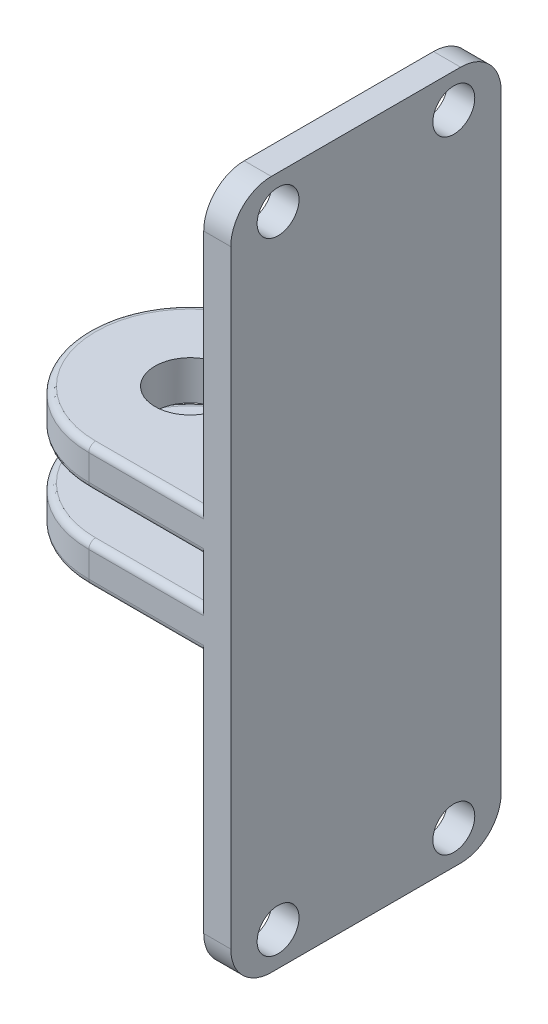
ISO-10303-21;
HEADER;
FILE_DESCRIPTION(('STEP AP214'),'2;1');
FILE_NAME('part.step','',(''),(''),'','','');
FILE_SCHEMA(('AUTOMOTIVE_DESIGN { 1 0 10303 214 1 1 1 1 }'));
ENDSEC;
DATA;
#1=APPLICATION_CONTEXT('core data for automotive mechanical design processes');
#2=APPLICATION_PROTOCOL_DEFINITION('international standard','automotive_design',2000,#1);
#3=PRODUCT_CONTEXT('',#1,'mechanical');
#4=PRODUCT('Part','Part','',(#3));
#5=PRODUCT_RELATED_PRODUCT_CATEGORY('part','',(#4));
#6=PRODUCT_DEFINITION_FORMATION('','',#4);
#7=PRODUCT_DEFINITION_CONTEXT('part definition',#1,'design');
#8=PRODUCT_DEFINITION('design','',#6,#7);
#9=PRODUCT_DEFINITION_SHAPE('','',#8);
#10=(LENGTH_UNIT() NAMED_UNIT(*) SI_UNIT(.MILLI.,.METRE.));
#11=(NAMED_UNIT(*) PLANE_ANGLE_UNIT() SI_UNIT($,.RADIAN.));
#12=(NAMED_UNIT(*) SI_UNIT($,.STERADIAN.) SOLID_ANGLE_UNIT());
#13=UNCERTAINTY_MEASURE_WITH_UNIT(LENGTH_MEASURE(1.E-05),#10,'distance_accuracy_value','');
#14=(GEOMETRIC_REPRESENTATION_CONTEXT(3) GLOBAL_UNCERTAINTY_ASSIGNED_CONTEXT((#13)) GLOBAL_UNIT_ASSIGNED_CONTEXT((#10,
#11,#12)) REPRESENTATION_CONTEXT('',''));
#15=CARTESIAN_POINT('',(0.,0.,0.));
#16=DIRECTION('',(0.,0.,1.));
#17=DIRECTION('',(1.,0.,0.));
#18=AXIS2_PLACEMENT_3D('',#15,#16,#17);
#19=CARTESIAN_POINT('',(0.,-7.5,4.55));
#20=DIRECTION('',(-1.,0.,0.));
#21=DIRECTION('',(0.,0.,1.));
#22=AXIS2_PLACEMENT_3D('',#19,#20,#21);
#23=PLANE('',#22);
#24=DIRECTION('',(0.,0.,-1.));
#25=VECTOR('',#24,1.);
#26=CARTESIAN_POINT('',(0.,25.5,0.));
#27=LINE('',#26,#25);
#28=CARTESIAN_POINT('',(0.,25.5,4.50000000000004));
#29=VERTEX_POINT('',#28);
#30=CARTESIAN_POINT('',(0.,25.5,-9.5));
#31=VERTEX_POINT('',#30);
#32=EDGE_CURVE('E358',#29,#31,#27,.T.);
#33=ORIENTED_EDGE('',*,*,#32,.T.);
#34=CARTESIAN_POINT('',(0.,22.5,-9.5));
#35=DIRECTION('',(-1.,0.,0.));
#36=DIRECTION('',(0.,0.,1.));
#37=AXIS2_PLACEMENT_3D('',#34,#35,#36);
#38=CIRCLE('',#37,3.);
#39=CARTESIAN_POINT('',(0.,22.5,-12.5));
#40=VERTEX_POINT('',#39);
#41=EDGE_CURVE('E322',#31,#40,#38,.T.);
#42=ORIENTED_EDGE('',*,*,#41,.T.);
#43=DIRECTION('',(0.,1.,0.));
#44=VECTOR('',#43,1.);
#45=CARTESIAN_POINT('',(0.,0.,-12.5));
#46=LINE('',#45,#44);
#47=CARTESIAN_POINT('',(0.,-22.5,-12.5));
#48=VERTEX_POINT('',#47);
#49=EDGE_CURVE('E349',#48,#40,#46,.T.);
#50=ORIENTED_EDGE('',*,*,#49,.F.);
#51=CARTESIAN_POINT('',(0.,-22.5,-9.5));
#52=DIRECTION('',(-1.,0.,0.));
#53=DIRECTION('',(0.,0.,1.));
#54=AXIS2_PLACEMENT_3D('',#51,#52,#53);
#55=CIRCLE('',#54,3.);
#56=CARTESIAN_POINT('',(0.,-25.5,-9.5));
#57=VERTEX_POINT('',#56);
#58=EDGE_CURVE('E61',#48,#57,#55,.T.);
#59=ORIENTED_EDGE('',*,*,#58,.T.);
#60=DIRECTION('',(0.,0.,-1.));
#61=VECTOR('',#60,1.);
#62=CARTESIAN_POINT('',(0.,-25.5,0.));
#63=LINE('',#62,#61);
#64=CARTESIAN_POINT('',(0.,-25.5,4.49999999999996));
#65=VERTEX_POINT('',#64);
#66=EDGE_CURVE('E335',#65,#57,#63,.T.);
#67=ORIENTED_EDGE('',*,*,#66,.F.);
#68=CARTESIAN_POINT('',(0.,-22.5,4.49999999999996));
#69=DIRECTION('',(-1.,0.,0.));
#70=DIRECTION('',(0.,0.,1.));
#71=AXIS2_PLACEMENT_3D('',#68,#69,#70);
#72=CIRCLE('',#71,3.);
#73=CARTESIAN_POINT('',(0.,-22.5,7.5));
#74=VERTEX_POINT('',#73);
#75=EDGE_CURVE('E55',#65,#74,#72,.T.);
#76=ORIENTED_EDGE('',*,*,#75,.T.);
#77=DIRECTION('',(0.,-1.,0.));
#78=VECTOR('',#77,1.);
#79=CARTESIAN_POINT('',(0.,0.,7.5));
#80=LINE('',#79,#78);
#81=CARTESIAN_POINT('',(0.,-4.05000000000001,7.5));
#82=VERTEX_POINT('',#81);
#83=EDGE_CURVE('E212',#82,#74,#80,.T.);
#84=ORIENTED_EDGE('',*,*,#83,.F.);
#85=CARTESIAN_POINT('',(0.,-4.05000000000001,6.99999999999999));
#86=DIRECTION('',(-1.,0.,0.));
#87=DIRECTION('',(0.,0.,1.));
#88=AXIS2_PLACEMENT_3D('',#85,#86,#87);
#89=CIRCLE('',#88,0.5);
#90=CARTESIAN_POINT('',(0.,-4.55000000000001,6.99999999999999));
#91=VERTEX_POINT('',#90);
#92=EDGE_CURVE('E263',#82,#91,#89,.F.);
#93=ORIENTED_EDGE('',*,*,#92,.T.);
#94=DIRECTION('',(0.,0.,1.));
#95=VECTOR('',#94,1.);
#96=CARTESIAN_POINT('',(0.,-4.54999999999999,-7.50000000000001));
#97=LINE('',#96,#95);
#98=CARTESIAN_POINT('',(0.,-4.54999999999999,-7.00000000000001));
#99=VERTEX_POINT('',#98);
#100=EDGE_CURVE('E395',#99,#91,#97,.T.);
#101=ORIENTED_EDGE('',*,*,#100,.F.);
#102=CARTESIAN_POINT('',(0.,-4.04999999999999,-7.00000000000001));
#103=DIRECTION('',(-1.,0.,0.));
#104=DIRECTION('',(0.,0.,1.));
#105=AXIS2_PLACEMENT_3D('',#102,#103,#104);
#106=CIRCLE('',#105,0.5);
#107=CARTESIAN_POINT('',(0.,-4.04999999999999,-7.50000000000001));
#108=VERTEX_POINT('',#107);
#109=EDGE_CURVE('E224',#99,#108,#106,.F.);
#110=ORIENTED_EDGE('',*,*,#109,.T.);
#111=DIRECTION('',(0.,-1.,0.));
#112=VECTOR('',#111,1.);
#113=CARTESIAN_POINT('',(0.,-1.64999999999999,-7.50000000000001));
#114=LINE('',#113,#112);
#115=CARTESIAN_POINT('',(0.,-2.14999999999999,-7.50000000000001));
#116=VERTEX_POINT('',#115);
#117=EDGE_CURVE('E404',#116,#108,#114,.T.);
#118=ORIENTED_EDGE('',*,*,#117,.F.);
#119=CARTESIAN_POINT('',(0.,-2.14999999999999,-7.00000000000001));
#120=DIRECTION('',(-1.,0.,0.));
#121=DIRECTION('',(0.,0.,1.));
#122=AXIS2_PLACEMENT_3D('',#119,#120,#121);
#123=CIRCLE('',#122,0.5);
#124=CARTESIAN_POINT('',(0.,-1.64999999999999,-7.));
#125=VERTEX_POINT('',#124);
#126=EDGE_CURVE('E274',#116,#125,#123,.F.);
#127=ORIENTED_EDGE('',*,*,#126,.T.);
#128=DIRECTION('',(0.,0.,-1.));
#129=VECTOR('',#128,1.);
#130=CARTESIAN_POINT('',(0.,-1.64999999999999,-7.50000000000001));
#131=LINE('',#130,#129);
#132=CARTESIAN_POINT('',(0.,-1.65000000000001,7.));
#133=VERTEX_POINT('',#132);
#134=EDGE_CURVE('E401',#133,#125,#131,.T.);
#135=ORIENTED_EDGE('',*,*,#134,.F.);
#136=CARTESIAN_POINT('',(0.,-2.15000000000001,7.));
#137=DIRECTION('',(-1.,0.,0.));
#138=DIRECTION('',(0.,0.,1.));
#139=AXIS2_PLACEMENT_3D('',#136,#137,#138);
#140=CIRCLE('',#139,0.5);
#141=CARTESIAN_POINT('',(0.,-2.15000000000001,7.50000000000001));
#142=VERTEX_POINT('',#141);
#143=EDGE_CURVE('E271',#133,#142,#140,.F.);
#144=ORIENTED_EDGE('',*,*,#143,.T.);
#145=DIRECTION('',(0.,-1.,0.));
#146=VECTOR('',#145,1.);
#147=CARTESIAN_POINT('',(0.,25.5,7.50000000000001));
#148=LINE('',#147,#146);
#149=CARTESIAN_POINT('',(0.,2.14999999999999,7.50000000000001));
#150=VERTEX_POINT('',#149);
#151=EDGE_CURVE('E368',#150,#142,#148,.T.);
#152=ORIENTED_EDGE('',*,*,#151,.F.);
#153=CARTESIAN_POINT('',(0.,2.14999999999999,7.));
#154=DIRECTION('',(-1.,0.,0.));
#155=DIRECTION('',(0.,0.,1.));
#156=AXIS2_PLACEMENT_3D('',#153,#154,#155);
#157=CIRCLE('',#156,0.5);
#158=CARTESIAN_POINT('',(0.,1.64999999999999,7.00000000000001));
#159=VERTEX_POINT('',#158);
#160=EDGE_CURVE('E269',#150,#159,#157,.F.);
#161=ORIENTED_EDGE('',*,*,#160,.T.);
#162=DIRECTION('',(0.,0.,1.));
#163=VECTOR('',#162,1.);
#164=CARTESIAN_POINT('',(0.,1.65000000000001,-7.5));
#165=LINE('',#164,#163);
#166=CARTESIAN_POINT('',(0.,1.65000000000001,-7.));
#167=VERTEX_POINT('',#166);
#168=EDGE_CURVE('E372',#167,#159,#165,.T.);
#169=ORIENTED_EDGE('',*,*,#168,.F.);
#170=CARTESIAN_POINT('',(0.,2.15000000000001,-7.));
#171=DIRECTION('',(-1.,0.,0.));
#172=DIRECTION('',(0.,0.,1.));
#173=AXIS2_PLACEMENT_3D('',#170,#171,#172);
#174=CIRCLE('',#173,0.5);
#175=CARTESIAN_POINT('',(0.,2.15000000000002,-7.5));
#176=VERTEX_POINT('',#175);
#177=EDGE_CURVE('E267',#167,#176,#174,.F.);
#178=ORIENTED_EDGE('',*,*,#177,.T.);
#179=DIRECTION('',(0.,-1.,0.));
#180=VECTOR('',#179,1.);
#181=CARTESIAN_POINT('',(0.,-1.64999999999999,-7.50000000000001));
#182=LINE('',#181,#180);
#183=CARTESIAN_POINT('',(0.,4.05000000000001,-7.5));
#184=VERTEX_POINT('',#183);
#185=EDGE_CURVE('E284',#184,#176,#182,.T.);
#186=ORIENTED_EDGE('',*,*,#185,.F.);
#187=CARTESIAN_POINT('',(0.,4.05000000000001,-6.99999999999999));
#188=DIRECTION('',(-1.,0.,0.));
#189=DIRECTION('',(0.,0.,1.));
#190=AXIS2_PLACEMENT_3D('',#187,#188,#189);
#191=CIRCLE('',#190,0.5);
#192=CARTESIAN_POINT('',(0.,4.55000000000001,-6.99999999999999));
#193=VERTEX_POINT('',#192);
#194=EDGE_CURVE('E223',#184,#193,#191,.F.);
#195=ORIENTED_EDGE('',*,*,#194,.T.);
#196=DIRECTION('',(0.,0.,-1.));
#197=VECTOR('',#196,1.);
#198=CARTESIAN_POINT('',(0.,4.55000000000001,-7.49999999999999));
#199=LINE('',#198,#197);
#200=CARTESIAN_POINT('',(0.,4.54999999999999,7.00000000000002));
#201=VERTEX_POINT('',#200);
#202=EDGE_CURVE('E219',#201,#193,#199,.T.);
#203=ORIENTED_EDGE('',*,*,#202,.F.);
#204=CARTESIAN_POINT('',(0.,4.04999999999999,7.00000000000001));
#205=DIRECTION('',(-1.,0.,0.));
#206=DIRECTION('',(0.,0.,1.));
#207=AXIS2_PLACEMENT_3D('',#204,#205,#206);
#208=CIRCLE('',#207,0.5);
#209=CARTESIAN_POINT('',(0.,4.04999999999999,7.50000000000001));
#210=VERTEX_POINT('',#209);
#211=EDGE_CURVE('E215',#201,#210,#208,.F.);
#212=ORIENTED_EDGE('',*,*,#211,.T.);
#213=CARTESIAN_POINT('',(0.,22.5,7.5));
#214=VERTEX_POINT('',#213);
#215=EDGE_CURVE('E200',#214,#210,#80,.T.);
#216=ORIENTED_EDGE('',*,*,#215,.F.);
#217=CARTESIAN_POINT('',(0.,22.5,4.50000000000004));
#218=DIRECTION('',(-1.,0.,0.));
#219=DIRECTION('',(0.,0.,1.));
#220=AXIS2_PLACEMENT_3D('',#217,#218,#219);
#221=CIRCLE('',#220,3.);
#222=EDGE_CURVE('E320',#214,#29,#221,.T.);
#223=ORIENTED_EDGE('',*,*,#222,.T.);
#224=EDGE_LOOP('',(#33,#42,#50,#59,#67,#76,#84,#93,#101,#110,#118,#127,#135,#144,#152,#161,#169,
#178,#186,#195,#203,#212,#216,#223));
#225=FACE_BOUND('',#224,.T.);
#226=CARTESIAN_POINT('',(0.,23.,4.00000000000001));
#227=DIRECTION('',(-1.,0.,0.));
#228=DIRECTION('',(0.,0.,1.));
#229=AXIS2_PLACEMENT_3D('',#226,#227,#228);
#230=CIRCLE('',#229,1.55);
#231=CARTESIAN_POINT('',(0.,23.,5.55000000000001));
#232=VERTEX_POINT('',#231);
#233=EDGE_CURVE('E362',#232,#232,#230,.F.);
#234=ORIENTED_EDGE('',*,*,#233,.T.);
#235=EDGE_LOOP('',(#234));
#236=FACE_BOUND('',#235,.T.);
#237=CARTESIAN_POINT('',(0.,23.,-9.));
#238=DIRECTION('',(-1.,0.,0.));
#239=DIRECTION('',(0.,0.,1.));
#240=AXIS2_PLACEMENT_3D('',#237,#238,#239);
#241=CIRCLE('',#240,1.55);
#242=CARTESIAN_POINT('',(0.,23.,-7.45));
#243=VERTEX_POINT('',#242);
#244=EDGE_CURVE('E355',#243,#243,#241,.F.);
#245=ORIENTED_EDGE('',*,*,#244,.T.);
#246=EDGE_LOOP('',(#245));
#247=FACE_BOUND('',#246,.T.);
#248=CARTESIAN_POINT('',(0.,-23.,-9.));
#249=DIRECTION('',(-1.,0.,0.));
#250=DIRECTION('',(0.,0.,1.));
#251=AXIS2_PLACEMENT_3D('',#248,#249,#250);
#252=CIRCLE('',#251,1.55);
#253=CARTESIAN_POINT('',(0.,-23.,-7.45));
#254=VERTEX_POINT('',#253);
#255=EDGE_CURVE('E298',#254,#254,#252,.F.);
#256=ORIENTED_EDGE('',*,*,#255,.T.);
#257=EDGE_LOOP('',(#256));
#258=FACE_BOUND('',#257,.T.);
#259=CARTESIAN_POINT('',(0.,-23.,4.));
#260=DIRECTION('',(-1.,0.,0.));
#261=DIRECTION('',(0.,0.,1.));
#262=AXIS2_PLACEMENT_3D('',#259,#260,#261);
#263=CIRCLE('',#262,1.55);
#264=CARTESIAN_POINT('',(0.,-23.,5.55));
#265=VERTEX_POINT('',#264);
#266=EDGE_CURVE('E359',#265,#265,#263,.F.);
#267=ORIENTED_EDGE('',*,*,#266,.T.);
#268=EDGE_LOOP('',(#267));
#269=FACE_BOUND('',#268,.T.);
#270=ADVANCED_FACE('F40',(#225,#236,#247,#258,#269),#23,.T.);
#271=CARTESIAN_POINT('',(2.,0.,0.));
#272=DIRECTION('',(1.,0.,0.));
#273=DIRECTION('',(0.,0.,-1.));
#274=AXIS2_PLACEMENT_3D('',#271,#272,#273);
#275=PLANE('',#274);
#276=DIRECTION('',(0.,1.,0.));
#277=VECTOR('',#276,1.);
#278=CARTESIAN_POINT('',(2.,0.,-12.5));
#279=LINE('',#278,#277);
#280=CARTESIAN_POINT('',(2.,-22.5,-12.5));
#281=VERTEX_POINT('',#280);
#282=CARTESIAN_POINT('',(2.,22.5,-12.5));
#283=VERTEX_POINT('',#282);
#284=EDGE_CURVE('E343',#281,#283,#279,.T.);
#285=ORIENTED_EDGE('',*,*,#284,.T.);
#286=CARTESIAN_POINT('',(2.,22.5,-9.5));
#287=DIRECTION('',(1.,0.,0.));
#288=DIRECTION('',(0.,0.,-1.));
#289=AXIS2_PLACEMENT_3D('',#286,#287,#288);
#290=CIRCLE('',#289,3.);
#291=CARTESIAN_POINT('',(2.,25.5,-9.5));
#292=VERTEX_POINT('',#291);
#293=EDGE_CURVE('E311',#283,#292,#290,.T.);
#294=ORIENTED_EDGE('',*,*,#293,.T.);
#295=DIRECTION('',(0.,0.,-1.));
#296=VECTOR('',#295,1.);
#297=CARTESIAN_POINT('',(2.,25.5,0.));
#298=LINE('',#297,#296);
#299=CARTESIAN_POINT('',(2.,25.5,4.50000000000004));
#300=VERTEX_POINT('',#299);
#301=EDGE_CURVE('E211',#300,#292,#298,.T.);
#302=ORIENTED_EDGE('',*,*,#301,.F.);
#303=CARTESIAN_POINT('',(2.,22.5,4.50000000000004));
#304=DIRECTION('',(1.,0.,0.));
#305=DIRECTION('',(0.,0.,-1.));
#306=AXIS2_PLACEMENT_3D('',#303,#304,#305);
#307=CIRCLE('',#306,3.);
#308=CARTESIAN_POINT('',(2.,22.5,7.5));
#309=VERTEX_POINT('',#308);
#310=EDGE_CURVE('E309',#300,#309,#307,.T.);
#311=ORIENTED_EDGE('',*,*,#310,.T.);
#312=DIRECTION('',(0.,-1.,0.));
#313=VECTOR('',#312,1.);
#314=CARTESIAN_POINT('',(2.,0.,7.5));
#315=LINE('',#314,#313);
#316=CARTESIAN_POINT('',(2.,-22.5,7.5));
#317=VERTEX_POINT('',#316);
#318=EDGE_CURVE('E346',#309,#317,#315,.T.);
#319=ORIENTED_EDGE('',*,*,#318,.T.);
#320=CARTESIAN_POINT('',(2.,-22.5,4.49999999999996));
#321=DIRECTION('',(1.,0.,0.));
#322=DIRECTION('',(0.,0.,-1.));
#323=AXIS2_PLACEMENT_3D('',#320,#321,#322);
#324=CIRCLE('',#323,3.);
#325=CARTESIAN_POINT('',(2.,-25.5,4.49999999999996));
#326=VERTEX_POINT('',#325);
#327=EDGE_CURVE('E307',#317,#326,#324,.T.);
#328=ORIENTED_EDGE('',*,*,#327,.T.);
#329=DIRECTION('',(0.,0.,-1.));
#330=VECTOR('',#329,1.);
#331=CARTESIAN_POINT('',(2.,-25.5,0.));
#332=LINE('',#331,#330);
#333=CARTESIAN_POINT('',(2.,-25.5,-9.5));
#334=VERTEX_POINT('',#333);
#335=EDGE_CURVE('E333',#326,#334,#332,.T.);
#336=ORIENTED_EDGE('',*,*,#335,.T.);
#337=CARTESIAN_POINT('',(2.,-22.5,-9.5));
#338=DIRECTION('',(1.,0.,0.));
#339=DIRECTION('',(0.,0.,-1.));
#340=AXIS2_PLACEMENT_3D('',#337,#338,#339);
#341=CIRCLE('',#340,3.);
#342=EDGE_CURVE('E305',#334,#281,#341,.T.);
#343=ORIENTED_EDGE('',*,*,#342,.T.);
#344=EDGE_LOOP('',(#285,#294,#302,#311,#319,#328,#336,#343));
#345=FACE_BOUND('',#344,.T.);
#346=CARTESIAN_POINT('',(2.,-23.,-9.));
#347=DIRECTION('',(1.,0.,0.));
#348=DIRECTION('',(0.,0.,-1.));
#349=AXIS2_PLACEMENT_3D('',#346,#347,#348);
#350=CIRCLE('',#349,1.55);
#351=CARTESIAN_POINT('',(2.,-23.,-10.55));
#352=VERTEX_POINT('',#351);
#353=EDGE_CURVE('E541',#352,#352,#350,.T.);
#354=ORIENTED_EDGE('',*,*,#353,.F.);
#355=EDGE_LOOP('',(#354));
#356=FACE_BOUND('',#355,.T.);
#357=CARTESIAN_POINT('',(2.,-23.,4.));
#358=DIRECTION('',(1.,0.,0.));
#359=DIRECTION('',(0.,0.,-1.));
#360=AXIS2_PLACEMENT_3D('',#357,#358,#359);
#361=CIRCLE('',#360,1.55);
#362=CARTESIAN_POINT('',(2.,-23.,2.45));
#363=VERTEX_POINT('',#362);
#364=EDGE_CURVE('E344',#363,#363,#361,.T.);
#365=ORIENTED_EDGE('',*,*,#364,.F.);
#366=EDGE_LOOP('',(#365));
#367=FACE_BOUND('',#366,.T.);
#368=CARTESIAN_POINT('',(2.,23.,4.00000000000001));
#369=DIRECTION('',(1.,0.,0.));
#370=DIRECTION('',(0.,0.,-1.));
#371=AXIS2_PLACEMENT_3D('',#368,#369,#370);
#372=CIRCLE('',#371,1.55);
#373=CARTESIAN_POINT('',(2.,23.,2.45000000000001));
#374=VERTEX_POINT('',#373);
#375=EDGE_CURVE('E545',#374,#374,#372,.T.);
#376=ORIENTED_EDGE('',*,*,#375,.F.);
#377=EDGE_LOOP('',(#376));
#378=FACE_BOUND('',#377,.T.);
#379=CARTESIAN_POINT('',(2.,23.,-9.));
#380=DIRECTION('',(1.,0.,0.));
#381=DIRECTION('',(0.,0.,-1.));
#382=AXIS2_PLACEMENT_3D('',#379,#380,#381);
#383=CIRCLE('',#382,1.55);
#384=CARTESIAN_POINT('',(2.,23.,-10.55));
#385=VERTEX_POINT('',#384);
#386=EDGE_CURVE('E367',#385,#385,#383,.T.);
#387=ORIENTED_EDGE('',*,*,#386,.F.);
#388=EDGE_LOOP('',(#387));
#389=FACE_BOUND('',#388,.T.);
#390=ADVANCED_FACE('F339',(#345,#356,#367,#378,#389),#275,.T.);
#391=CARTESIAN_POINT('',(-16.,4.54999999999999,7.50000000000001));
#392=DIRECTION('',(0.,0.,-1.));
#393=DIRECTION('',(0.,1.,0.));
#394=AXIS2_PLACEMENT_3D('',#391,#392,#393);
#395=PLANE('',#394);
#396=ORIENTED_EDGE('',*,*,#318,.F.);
#397=DIRECTION('',(1.,0.,0.));
#398=VECTOR('',#397,1.);
#399=CARTESIAN_POINT('',(-16.,22.5,7.50000000000004));
#400=LINE('',#399,#398);
#401=EDGE_CURVE('E209',#309,#214,#400,.F.);
#402=ORIENTED_EDGE('',*,*,#401,.T.);
#403=ORIENTED_EDGE('',*,*,#215,.T.);
#404=DIRECTION('',(1.,0.,0.));
#405=VECTOR('',#404,1.);
#406=CARTESIAN_POINT('',(-16.,4.04999999999999,7.50000000000001));
#407=LINE('',#406,#405);
#408=CARTESIAN_POINT('',(-8.5,4.04999999999999,7.50000000000001));
#409=VERTEX_POINT('',#408);
#410=EDGE_CURVE('E206',#210,#409,#407,.F.);
#411=ORIENTED_EDGE('',*,*,#410,.T.);
#412=DIRECTION('',(0.,-1.,0.));
#413=VECTOR('',#412,1.);
#414=CARTESIAN_POINT('',(-8.5,26.25,7.50000000000005));
#415=LINE('',#414,#413);
#416=CARTESIAN_POINT('',(-8.5,2.14999999999999,7.50000000000001));
#417=VERTEX_POINT('',#416);
#418=EDGE_CURVE('E375',#409,#417,#415,.T.);
#419=ORIENTED_EDGE('',*,*,#418,.T.);
#420=DIRECTION('',(1.,0.,0.));
#421=VECTOR('',#420,1.);
#422=CARTESIAN_POINT('',(-16.,2.14999999999999,7.50000000000001));
#423=LINE('',#422,#421);
#424=EDGE_CURVE('E231',#417,#150,#423,.T.);
#425=ORIENTED_EDGE('',*,*,#424,.T.);
#426=ORIENTED_EDGE('',*,*,#151,.T.);
#427=DIRECTION('',(1.,0.,0.));
#428=VECTOR('',#427,1.);
#429=CARTESIAN_POINT('',(-16.,-2.15000000000001,7.5));
#430=LINE('',#429,#428);
#431=CARTESIAN_POINT('',(-8.5,-2.15000000000002,7.5));
#432=VERTEX_POINT('',#431);
#433=EDGE_CURVE('E409',#142,#432,#430,.F.);
#434=ORIENTED_EDGE('',*,*,#433,.T.);
#435=DIRECTION('',(0.,-1.,0.));
#436=VECTOR('',#435,1.);
#437=CARTESIAN_POINT('',(-8.5,26.25,7.50000000000005));
#438=LINE('',#437,#436);
#439=CARTESIAN_POINT('',(-8.5,-4.05000000000001,7.5));
#440=VERTEX_POINT('',#439);
#441=EDGE_CURVE('E392',#432,#440,#438,.T.);
#442=ORIENTED_EDGE('',*,*,#441,.T.);
#443=DIRECTION('',(1.,0.,0.));
#444=VECTOR('',#443,1.);
#445=CARTESIAN_POINT('',(0.,-4.05000000000001,7.5));
#446=LINE('',#445,#444);
#447=EDGE_CURVE('E411',#440,#82,#446,.T.);
#448=ORIENTED_EDGE('',*,*,#447,.T.);
#449=ORIENTED_EDGE('',*,*,#83,.T.);
#450=DIRECTION('',(1.,0.,0.));
#451=VECTOR('',#450,1.);
#452=CARTESIAN_POINT('',(2.,-22.5,7.49999999999997));
#453=LINE('',#452,#451);
#454=EDGE_CURVE('E324',#74,#317,#453,.T.);
#455=ORIENTED_EDGE('',*,*,#454,.T.);
#456=EDGE_LOOP('',(#396,#402,#403,#411,#419,#425,#426,#434,#442,#448,#449,#455));
#457=FACE_BOUND('',#456,.T.);
#458=ADVANCED_FACE('F203',(#457),#395,.F.);
#459=CARTESIAN_POINT('',(-13.5207248326412,-4.55,0.));
#460=DIRECTION('',(0.,-1.,0.));
#461=DIRECTION('',(1.,0.,0.));
#462=AXIS2_PLACEMENT_3D('',#459,#460,#461);
#463=PLANE('',#462);
#464=ORIENTED_EDGE('',*,*,#100,.T.);
#465=DIRECTION('',(1.,0.,0.));
#466=VECTOR('',#465,1.);
#467=CARTESIAN_POINT('',(-8.5,-4.55000000000001,6.99999999999999));
#468=LINE('',#467,#466);
#469=CARTESIAN_POINT('',(-8.5,-4.55000000000001,6.99999999999999));
#470=VERTEX_POINT('',#469);
#471=EDGE_CURVE('E418',#91,#470,#468,.F.);
#472=ORIENTED_EDGE('',*,*,#471,.T.);
#473=CARTESIAN_POINT('',(-8.5,-4.55,0.));
#474=DIRECTION('',(0.,-1.,0.));
#475=DIRECTION('',(0.,0.,-1.));
#476=AXIS2_PLACEMENT_3D('',#473,#474,#475);
#477=CIRCLE('',#476,7.);
#478=CARTESIAN_POINT('',(-8.5,-4.54999999999999,-7.00000000000001));
#479=VERTEX_POINT('',#478);
#480=EDGE_CURVE('E414',#470,#479,#477,.T.);
#481=ORIENTED_EDGE('',*,*,#480,.T.);
#482=DIRECTION('',(1.,0.,0.));
#483=VECTOR('',#482,1.);
#484=CARTESIAN_POINT('',(0.,-4.54999999999999,-7.00000000000001));
#485=LINE('',#484,#483);
#486=EDGE_CURVE('E416',#479,#99,#485,.T.);
#487=ORIENTED_EDGE('',*,*,#486,.T.);
#488=EDGE_LOOP('',(#464,#472,#481,#487));
#489=FACE_BOUND('',#488,.T.);
#490=CARTESIAN_POINT('',(-8.5,-4.55,0.));
#491=DIRECTION('',(0.,-1.,0.));
#492=DIRECTION('',(1.,0.,0.));
#493=AXIS2_PLACEMENT_3D('',#490,#491,#492);
#494=CIRCLE('',#493,2.6);
#495=CARTESIAN_POINT('',(-5.9,-4.55,0.));
#496=VERTEX_POINT('',#495);
#497=EDGE_CURVE('E383',#496,#496,#494,.T.);
#498=ORIENTED_EDGE('',*,*,#497,.F.);
#499=EDGE_LOOP('',(#498));
#500=FACE_BOUND('',#499,.T.);
#501=ADVANCED_FACE('F478',(#489,#500),#463,.T.);
#502=CARTESIAN_POINT('',(-16.,-1.64999999999999,-7.50000000000001));
#503=DIRECTION('',(0.,-1.,0.));
#504=DIRECTION('',(1.,0.,0.));
#505=AXIS2_PLACEMENT_3D('',#502,#503,#504);
#506=PLANE('',#505);
#507=CARTESIAN_POINT('',(-8.5,-1.65,0.));
#508=DIRECTION('',(0.,-1.,0.));
#509=DIRECTION('',(1.,0.,0.));
#510=AXIS2_PLACEMENT_3D('',#507,#508,#509);
#511=CIRCLE('',#510,2.6);
#512=CARTESIAN_POINT('',(-5.9,-1.65,0.));
#513=VERTEX_POINT('',#512);
#514=EDGE_CURVE('E391',#513,#513,#511,.T.);
#515=ORIENTED_EDGE('',*,*,#514,.T.);
#516=EDGE_LOOP('',(#515));
#517=FACE_BOUND('',#516,.T.);
#518=CARTESIAN_POINT('',(-8.5,-1.65,0.));
#519=DIRECTION('',(0.,-1.,0.));
#520=DIRECTION('',(0.,0.,-1.));
#521=AXIS2_PLACEMENT_3D('',#518,#519,#520);
#522=CIRCLE('',#521,7.);
#523=CARTESIAN_POINT('',(-8.5,-1.64999999999999,-7.));
#524=VERTEX_POINT('',#523);
#525=CARTESIAN_POINT('',(-8.5,-1.65000000000001,7.));
#526=VERTEX_POINT('',#525);
#527=EDGE_CURVE('E250',#524,#526,#522,.F.);
#528=ORIENTED_EDGE('',*,*,#527,.T.);
#529=DIRECTION('',(1.,0.,0.));
#530=VECTOR('',#529,1.);
#531=CARTESIAN_POINT('',(-16.,-1.65000000000001,7.));
#532=LINE('',#531,#530);
#533=EDGE_CURVE('E252',#526,#133,#532,.T.);
#534=ORIENTED_EDGE('',*,*,#533,.T.);
#535=ORIENTED_EDGE('',*,*,#134,.T.);
#536=DIRECTION('',(1.,0.,0.));
#537=VECTOR('',#536,1.);
#538=CARTESIAN_POINT('',(-16.,-1.64999999999999,-7.));
#539=LINE('',#538,#537);
#540=EDGE_CURVE('E248',#125,#524,#539,.F.);
#541=ORIENTED_EDGE('',*,*,#540,.T.);
#542=EDGE_LOOP('',(#528,#534,#535,#541));
#543=FACE_BOUND('',#542,.T.);
#544=ADVANCED_FACE('F571',(#517,#543),#506,.F.);
#545=CARTESIAN_POINT('',(-16.,-1.64999999999999,-7.50000000000001));
#546=DIRECTION('',(0.,0.,1.));
#547=DIRECTION('',(0.,-1.,0.));
#548=AXIS2_PLACEMENT_3D('',#545,#546,#547);
#549=PLANE('',#548);
#550=ORIENTED_EDGE('',*,*,#117,.T.);
#551=DIRECTION('',(1.,0.,0.));
#552=VECTOR('',#551,1.);
#553=CARTESIAN_POINT('',(-8.5,-4.04999999999999,-7.50000000000001));
#554=LINE('',#553,#552);
#555=CARTESIAN_POINT('',(-8.5,-4.04999999999999,-7.50000000000001));
#556=VERTEX_POINT('',#555);
#557=EDGE_CURVE('E422',#108,#556,#554,.F.);
#558=ORIENTED_EDGE('',*,*,#557,.T.);
#559=DIRECTION('',(0.,-1.,0.));
#560=VECTOR('',#559,1.);
#561=CARTESIAN_POINT('',(-8.5,26.25,-7.49999999999996));
#562=LINE('',#561,#560);
#563=CARTESIAN_POINT('',(-8.5,-2.14999999999999,-7.50000000000001));
#564=VERTEX_POINT('',#563);
#565=EDGE_CURVE('E396',#564,#556,#562,.T.);
#566=ORIENTED_EDGE('',*,*,#565,.F.);
#567=DIRECTION('',(1.,0.,0.));
#568=VECTOR('',#567,1.);
#569=CARTESIAN_POINT('',(-16.,-2.14999999999999,-7.50000000000001));
#570=LINE('',#569,#568);
#571=EDGE_CURVE('E420',#564,#116,#570,.T.);
#572=ORIENTED_EDGE('',*,*,#571,.T.);
#573=EDGE_LOOP('',(#550,#558,#566,#572));
#574=FACE_BOUND('',#573,.T.);
#575=ADVANCED_FACE('F565',(#574),#549,.F.);
#576=CARTESIAN_POINT('',(-8.5,26.25,0.));
#577=DIRECTION('',(0.,-1.,0.));
#578=DIRECTION('',(1.,0.,0.));
#579=AXIS2_PLACEMENT_3D('',#576,#577,#578);
#580=CYLINDRICAL_SURFACE('',#579,7.5);
#581=ORIENTED_EDGE('',*,*,#441,.F.);
#582=CARTESIAN_POINT('',(-8.5,-2.15000000000001,0.));
#583=DIRECTION('',(0.,-1.,0.));
#584=DIRECTION('',(0.,0.,-1.));
#585=AXIS2_PLACEMENT_3D('',#582,#583,#584);
#586=CIRCLE('',#585,7.5);
#587=EDGE_CURVE('E257',#432,#564,#586,.T.);
#588=ORIENTED_EDGE('',*,*,#587,.T.);
#589=ORIENTED_EDGE('',*,*,#565,.T.);
#590=CARTESIAN_POINT('',(-8.5,-4.05,0.));
#591=DIRECTION('',(0.,-1.,0.));
#592=DIRECTION('',(0.,0.,-1.));
#593=AXIS2_PLACEMENT_3D('',#590,#591,#592);
#594=CIRCLE('',#593,7.5);
#595=EDGE_CURVE('E255',#556,#440,#594,.F.);
#596=ORIENTED_EDGE('',*,*,#595,.T.);
#597=EDGE_LOOP('',(#581,#588,#589,#596));
#598=FACE_BOUND('',#597,.T.);
#599=ADVANCED_FACE('F561',(#598),#580,.T.);
#600=CARTESIAN_POINT('',(-8.5,26.25,0.));
#601=DIRECTION('',(0.,-1.,0.));
#602=DIRECTION('',(1.,0.,0.));
#603=AXIS2_PLACEMENT_3D('',#600,#601,#602);
#604=CYLINDRICAL_SURFACE('',#603,2.6);
#605=ORIENTED_EDGE('',*,*,#497,.T.);
#606=EDGE_LOOP('',(#605));
#607=FACE_BOUND('',#606,.T.);
#608=ORIENTED_EDGE('',*,*,#514,.F.);
#609=EDGE_LOOP('',(#608));
#610=FACE_BOUND('',#609,.T.);
#611=ADVANCED_FACE('F486',(#607,#610),#604,.F.);
#612=CARTESIAN_POINT('',(-16.,-1.64999999999999,-7.50000000000001));
#613=DIRECTION('',(0.,0.,1.));
#614=DIRECTION('',(0.,-1.,0.));
#615=AXIS2_PLACEMENT_3D('',#612,#613,#614);
#616=PLANE('',#615);
#617=DIRECTION('',(0.,-1.,0.));
#618=VECTOR('',#617,1.);
#619=CARTESIAN_POINT('',(-8.5,26.25,-7.49999999999996));
#620=LINE('',#619,#618);
#621=CARTESIAN_POINT('',(-8.5,4.05000000000001,-7.5));
#622=VERTEX_POINT('',#621);
#623=CARTESIAN_POINT('',(-8.5,2.15000000000001,-7.5));
#624=VERTEX_POINT('',#623);
#625=EDGE_CURVE('E380',#622,#624,#620,.T.);
#626=ORIENTED_EDGE('',*,*,#625,.F.);
#627=DIRECTION('',(1.,0.,0.));
#628=VECTOR('',#627,1.);
#629=CARTESIAN_POINT('',(-16.,4.05000000000001,-7.5));
#630=LINE('',#629,#628);
#631=EDGE_CURVE('E233',#622,#184,#630,.T.);
#632=ORIENTED_EDGE('',*,*,#631,.T.);
#633=ORIENTED_EDGE('',*,*,#185,.T.);
#634=DIRECTION('',(1.,0.,0.));
#635=VECTOR('',#634,1.);
#636=CARTESIAN_POINT('',(-16.,2.15000000000001,-7.5));
#637=LINE('',#636,#635);
#638=EDGE_CURVE('E230',#176,#624,#637,.F.);
#639=ORIENTED_EDGE('',*,*,#638,.T.);
#640=EDGE_LOOP('',(#626,#632,#633,#639));
#641=FACE_BOUND('',#640,.T.);
#642=ADVANCED_FACE('F441',(#641),#616,.F.);
#643=CARTESIAN_POINT('',(-8.5,26.25,0.));
#644=DIRECTION('',(0.,-1.,0.));
#645=DIRECTION('',(1.,0.,0.));
#646=AXIS2_PLACEMENT_3D('',#643,#644,#645);
#647=CYLINDRICAL_SURFACE('',#646,2.6);
#648=CARTESIAN_POINT('',(-8.5,1.65,0.));
#649=DIRECTION('',(0.,1.,0.));
#650=DIRECTION('',(-1.,0.,0.));
#651=AXIS2_PLACEMENT_3D('',#648,#649,#650);
#652=CIRCLE('',#651,2.6);
#653=CARTESIAN_POINT('',(-11.1,1.65,0.));
#654=VERTEX_POINT('',#653);
#655=EDGE_CURVE('E379',#654,#654,#652,.T.);
#656=ORIENTED_EDGE('',*,*,#655,.F.);
#657=EDGE_LOOP('',(#656));
#658=FACE_BOUND('',#657,.T.);
#659=CARTESIAN_POINT('',(-8.5,4.55,0.));
#660=DIRECTION('',(0.,-1.,0.));
#661=DIRECTION('',(1.,0.,0.));
#662=AXIS2_PLACEMENT_3D('',#659,#660,#661);
#663=CIRCLE('',#662,2.6);
#664=CARTESIAN_POINT('',(-5.9,4.55,0.));
#665=VERTEX_POINT('',#664);
#666=EDGE_CURVE('E376',#665,#665,#663,.T.);
#667=ORIENTED_EDGE('',*,*,#666,.F.);
#668=EDGE_LOOP('',(#667));
#669=FACE_BOUND('',#668,.T.);
#670=ADVANCED_FACE('F589',(#658,#669),#647,.F.);
#671=CARTESIAN_POINT('',(-8.5,26.25,0.));
#672=DIRECTION('',(0.,-1.,0.));
#673=DIRECTION('',(1.,0.,0.));
#674=AXIS2_PLACEMENT_3D('',#671,#672,#673);
#675=CYLINDRICAL_SURFACE('',#674,7.5);
#676=ORIENTED_EDGE('',*,*,#418,.F.);
#677=CARTESIAN_POINT('',(-8.5,4.05,0.));
#678=DIRECTION('',(0.,-1.,0.));
#679=DIRECTION('',(0.,0.,-1.));
#680=AXIS2_PLACEMENT_3D('',#677,#678,#679);
#681=CIRCLE('',#680,7.5);
#682=EDGE_CURVE('E261',#409,#622,#681,.T.);
#683=ORIENTED_EDGE('',*,*,#682,.T.);
#684=ORIENTED_EDGE('',*,*,#625,.T.);
#685=CARTESIAN_POINT('',(-8.5,2.15,0.));
#686=DIRECTION('',(0.,1.,0.));
#687=DIRECTION('',(0.,0.,1.));
#688=AXIS2_PLACEMENT_3D('',#685,#686,#687);
#689=CIRCLE('',#688,7.5);
#690=EDGE_CURVE('E259',#624,#417,#689,.T.);
#691=ORIENTED_EDGE('',*,*,#690,.T.);
#692=EDGE_LOOP('',(#676,#683,#684,#691));
#693=FACE_BOUND('',#692,.T.);
#694=ADVANCED_FACE('F437',(#693),#675,.T.);
#695=CARTESIAN_POINT('',(-13.5207248326412,4.55,0.));
#696=DIRECTION('',(0.,-1.,0.));
#697=DIRECTION('',(1.,0.,0.));
#698=AXIS2_PLACEMENT_3D('',#695,#696,#697);
#699=PLANE('',#698);
#700=ORIENTED_EDGE('',*,*,#666,.T.);
#701=EDGE_LOOP('',(#700));
#702=FACE_BOUND('',#701,.T.);
#703=CARTESIAN_POINT('',(-8.5,4.55,0.));
#704=DIRECTION('',(0.,-1.,0.));
#705=DIRECTION('',(0.,0.,-1.));
#706=AXIS2_PLACEMENT_3D('',#703,#704,#705);
#707=CIRCLE('',#706,7.);
#708=CARTESIAN_POINT('',(-8.5,4.55000000000001,-6.99999999999999));
#709=VERTEX_POINT('',#708);
#710=CARTESIAN_POINT('',(-8.5,4.54999999999999,7.00000000000001));
#711=VERTEX_POINT('',#710);
#712=EDGE_CURVE('E424',#709,#711,#707,.F.);
#713=ORIENTED_EDGE('',*,*,#712,.T.);
#714=DIRECTION('',(1.,0.,0.));
#715=VECTOR('',#714,1.);
#716=CARTESIAN_POINT('',(-13.5207248326412,4.54999999999999,7.00000000000001));
#717=LINE('',#716,#715);
#718=EDGE_CURVE('E236',#711,#201,#717,.T.);
#719=ORIENTED_EDGE('',*,*,#718,.T.);
#720=ORIENTED_EDGE('',*,*,#202,.T.);
#721=DIRECTION('',(1.,0.,0.));
#722=VECTOR('',#721,1.);
#723=CARTESIAN_POINT('',(-13.5207248326412,4.55000000000001,-6.99999999999999));
#724=LINE('',#723,#722);
#725=EDGE_CURVE('E426',#193,#709,#724,.F.);
#726=ORIENTED_EDGE('',*,*,#725,.T.);
#727=EDGE_LOOP('',(#713,#719,#720,#726));
#728=FACE_BOUND('',#727,.T.);
#729=ADVANCED_FACE('F428',(#702,#728),#699,.F.);
#730=CARTESIAN_POINT('',(-16.,1.65000000000001,-7.5));
#731=DIRECTION('',(0.,1.,0.));
#732=DIRECTION('',(-1.,0.,0.));
#733=AXIS2_PLACEMENT_3D('',#730,#731,#732);
#734=PLANE('',#733);
#735=ORIENTED_EDGE('',*,*,#655,.T.);
#736=EDGE_LOOP('',(#735));
#737=FACE_BOUND('',#736,.T.);
#738=CARTESIAN_POINT('',(-8.5,1.65,0.));
#739=DIRECTION('',(0.,1.,0.));
#740=DIRECTION('',(0.,0.,1.));
#741=AXIS2_PLACEMENT_3D('',#738,#739,#740);
#742=CIRCLE('',#741,7.);
#743=CARTESIAN_POINT('',(-8.5,1.64999999999999,7.));
#744=VERTEX_POINT('',#743);
#745=CARTESIAN_POINT('',(-8.5,1.65000000000001,-7.));
#746=VERTEX_POINT('',#745);
#747=EDGE_CURVE('E241',#744,#746,#742,.F.);
#748=ORIENTED_EDGE('',*,*,#747,.T.);
#749=DIRECTION('',(1.,0.,0.));
#750=VECTOR('',#749,1.);
#751=CARTESIAN_POINT('',(-16.,1.65000000000001,-7.));
#752=LINE('',#751,#750);
#753=EDGE_CURVE('E245',#746,#167,#752,.T.);
#754=ORIENTED_EDGE('',*,*,#753,.T.);
#755=ORIENTED_EDGE('',*,*,#168,.T.);
#756=DIRECTION('',(1.,0.,0.));
#757=VECTOR('',#756,1.);
#758=CARTESIAN_POINT('',(-16.,1.64999999999999,7.));
#759=LINE('',#758,#757);
#760=EDGE_CURVE('E243',#159,#744,#759,.F.);
#761=ORIENTED_EDGE('',*,*,#760,.T.);
#762=EDGE_LOOP('',(#748,#754,#755,#761));
#763=FACE_BOUND('',#762,.T.);
#764=ADVANCED_FACE('F462',(#737,#763),#734,.F.);
#765=CARTESIAN_POINT('',(-13.5207248326412,-4.04999999999999,-7.00000000000001));
#766=DIRECTION('',(-1.,0.,0.));
#767=DIRECTION('',(0.,0.,1.));
#768=AXIS2_PLACEMENT_3D('',#765,#766,#767);
#769=CYLINDRICAL_SURFACE('',#768,0.5);
#770=ORIENTED_EDGE('',*,*,#109,.F.);
#771=ORIENTED_EDGE('',*,*,#486,.F.);
#772=CARTESIAN_POINT('',(-8.5,-4.04999999999999,-7.00000000000001));
#773=DIRECTION('',(-1.,0.,0.));
#774=DIRECTION('',(0.,0.,1.));
#775=AXIS2_PLACEMENT_3D('',#772,#773,#774);
#776=CIRCLE('',#775,0.5);
#777=EDGE_CURVE('E280',#556,#479,#776,.T.);
#778=ORIENTED_EDGE('',*,*,#777,.F.);
#779=ORIENTED_EDGE('',*,*,#557,.F.);
#780=EDGE_LOOP('',(#770,#771,#778,#779));
#781=FACE_BOUND('',#780,.T.);
#782=ADVANCED_FACE('F464',(#781),#769,.T.);
#783=CARTESIAN_POINT('',(-8.5,-4.05,0.));
#784=DIRECTION('',(0.,-1.,0.));
#785=DIRECTION('',(0.,0.,-1.));
#786=AXIS2_PLACEMENT_3D('',#783,#784,#785);
#787=TOROIDAL_SURFACE('',#786,7.,0.5);
#788=ORIENTED_EDGE('',*,*,#777,.T.);
#789=ORIENTED_EDGE('',*,*,#480,.F.);
#790=CARTESIAN_POINT('',(-8.5,-4.05000000000001,6.99999999999999));
#791=DIRECTION('',(1.,0.,0.));
#792=DIRECTION('',(0.,0.,-1.));
#793=AXIS2_PLACEMENT_3D('',#790,#791,#792);
#794=CIRCLE('',#793,0.5);
#795=EDGE_CURVE('E277',#440,#470,#794,.T.);
#796=ORIENTED_EDGE('',*,*,#795,.F.);
#797=ORIENTED_EDGE('',*,*,#595,.F.);
#798=EDGE_LOOP('',(#788,#789,#796,#797));
#799=FACE_BOUND('',#798,.T.);
#800=ADVANCED_FACE('F471',(#799),#787,.T.);
#801=CARTESIAN_POINT('',(-16.,-4.05000000000001,6.99999999999999));
#802=DIRECTION('',(-1.,0.,0.));
#803=DIRECTION('',(0.,0.,1.));
#804=AXIS2_PLACEMENT_3D('',#801,#802,#803);
#805=CYLINDRICAL_SURFACE('',#804,0.5);
#806=ORIENTED_EDGE('',*,*,#795,.T.);
#807=ORIENTED_EDGE('',*,*,#471,.F.);
#808=ORIENTED_EDGE('',*,*,#92,.F.);
#809=ORIENTED_EDGE('',*,*,#447,.F.);
#810=EDGE_LOOP('',(#806,#807,#808,#809));
#811=FACE_BOUND('',#810,.T.);
#812=ADVANCED_FACE('F489',(#811),#805,.T.);
#813=CARTESIAN_POINT('',(-16.,4.05000000000001,-6.99999999999999));
#814=DIRECTION('',(1.,0.,0.));
#815=DIRECTION('',(0.,0.,-1.));
#816=AXIS2_PLACEMENT_3D('',#813,#814,#815);
#817=CYLINDRICAL_SURFACE('',#816,0.5);
#818=ORIENTED_EDGE('',*,*,#194,.F.);
#819=ORIENTED_EDGE('',*,*,#631,.F.);
#820=CARTESIAN_POINT('',(-8.5,4.05000000000001,-6.99999999999999));
#821=DIRECTION('',(-1.,0.,0.));
#822=DIRECTION('',(0.,0.,1.));
#823=AXIS2_PLACEMENT_3D('',#820,#821,#822);
#824=CIRCLE('',#823,0.5);
#825=EDGE_CURVE('E281',#709,#622,#824,.T.);
#826=ORIENTED_EDGE('',*,*,#825,.F.);
#827=ORIENTED_EDGE('',*,*,#725,.F.);
#828=EDGE_LOOP('',(#818,#819,#826,#827));
#829=FACE_BOUND('',#828,.T.);
#830=ADVANCED_FACE('F446',(#829),#817,.T.);
#831=CARTESIAN_POINT('',(-8.5,4.05,0.));
#832=DIRECTION('',(0.,-1.,0.));
#833=DIRECTION('',(0.,0.,-1.));
#834=AXIS2_PLACEMENT_3D('',#831,#832,#833);
#835=TOROIDAL_SURFACE('',#834,7.,0.5);
#836=ORIENTED_EDGE('',*,*,#825,.T.);
#837=ORIENTED_EDGE('',*,*,#682,.F.);
#838=CARTESIAN_POINT('',(-8.5,4.04999999999999,7.00000000000001));
#839=DIRECTION('',(1.,0.,0.));
#840=DIRECTION('',(0.,0.,-1.));
#841=AXIS2_PLACEMENT_3D('',#838,#839,#840);
#842=CIRCLE('',#841,0.5);
#843=EDGE_CURVE('E229',#711,#409,#842,.T.);
#844=ORIENTED_EDGE('',*,*,#843,.F.);
#845=ORIENTED_EDGE('',*,*,#712,.F.);
#846=EDGE_LOOP('',(#836,#837,#844,#845));
#847=FACE_BOUND('',#846,.T.);
#848=ADVANCED_FACE('F434',(#847),#835,.T.);
#849=CARTESIAN_POINT('',(-13.5207248326412,4.04999999999999,7.00000000000001));
#850=DIRECTION('',(1.,0.,0.));
#851=DIRECTION('',(0.,0.,-1.));
#852=AXIS2_PLACEMENT_3D('',#849,#850,#851);
#853=CYLINDRICAL_SURFACE('',#852,0.5);
#854=ORIENTED_EDGE('',*,*,#843,.T.);
#855=ORIENTED_EDGE('',*,*,#410,.F.);
#856=ORIENTED_EDGE('',*,*,#211,.F.);
#857=ORIENTED_EDGE('',*,*,#718,.F.);
#858=EDGE_LOOP('',(#854,#855,#856,#857));
#859=FACE_BOUND('',#858,.T.);
#860=ADVANCED_FACE('F227',(#859),#853,.T.);
#861=CARTESIAN_POINT('',(-16.,2.14999999999999,7.));
#862=DIRECTION('',(1.,0.,0.));
#863=DIRECTION('',(0.,0.,-1.));
#864=AXIS2_PLACEMENT_3D('',#861,#862,#863);
#865=CYLINDRICAL_SURFACE('',#864,0.5);
#866=ORIENTED_EDGE('',*,*,#160,.F.);
#867=ORIENTED_EDGE('',*,*,#424,.F.);
#868=CARTESIAN_POINT('',(-8.5,2.14999999999999,7.));
#869=DIRECTION('',(-1.,0.,0.));
#870=DIRECTION('',(0.,0.,1.));
#871=AXIS2_PLACEMENT_3D('',#868,#869,#870);
#872=CIRCLE('',#871,0.5);
#873=EDGE_CURVE('E286',#744,#417,#872,.T.);
#874=ORIENTED_EDGE('',*,*,#873,.F.);
#875=ORIENTED_EDGE('',*,*,#760,.F.);
#876=EDGE_LOOP('',(#866,#867,#874,#875));
#877=FACE_BOUND('',#876,.T.);
#878=ADVANCED_FACE('F459',(#877),#865,.T.);
#879=CARTESIAN_POINT('',(-8.5,2.15,0.));
#880=DIRECTION('',(0.,1.,0.));
#881=DIRECTION('',(0.,0.,1.));
#882=AXIS2_PLACEMENT_3D('',#879,#880,#881);
#883=TOROIDAL_SURFACE('',#882,7.,0.5);
#884=ORIENTED_EDGE('',*,*,#873,.T.);
#885=ORIENTED_EDGE('',*,*,#690,.F.);
#886=CARTESIAN_POINT('',(-8.5,2.15000000000001,-7.));
#887=DIRECTION('',(1.,0.,0.));
#888=DIRECTION('',(0.,0.,-1.));
#889=AXIS2_PLACEMENT_3D('',#886,#887,#888);
#890=CIRCLE('',#889,0.5);
#891=EDGE_CURVE('E289',#746,#624,#890,.T.);
#892=ORIENTED_EDGE('',*,*,#891,.F.);
#893=ORIENTED_EDGE('',*,*,#747,.F.);
#894=EDGE_LOOP('',(#884,#885,#892,#893));
#895=FACE_BOUND('',#894,.T.);
#896=ADVANCED_FACE('F454',(#895),#883,.T.);
#897=CARTESIAN_POINT('',(-16.,2.15000000000001,-7.));
#898=DIRECTION('',(1.,0.,0.));
#899=DIRECTION('',(0.,0.,-1.));
#900=AXIS2_PLACEMENT_3D('',#897,#898,#899);
#901=CYLINDRICAL_SURFACE('',#900,0.5);
#902=ORIENTED_EDGE('',*,*,#891,.T.);
#903=ORIENTED_EDGE('',*,*,#638,.F.);
#904=ORIENTED_EDGE('',*,*,#177,.F.);
#905=ORIENTED_EDGE('',*,*,#753,.F.);
#906=EDGE_LOOP('',(#902,#903,#904,#905));
#907=FACE_BOUND('',#906,.T.);
#908=ADVANCED_FACE('F449',(#907),#901,.T.);
#909=CARTESIAN_POINT('',(-16.,-2.14999999999999,-7.00000000000001));
#910=DIRECTION('',(1.,0.,0.));
#911=DIRECTION('',(0.,0.,-1.));
#912=AXIS2_PLACEMENT_3D('',#909,#910,#911);
#913=CYLINDRICAL_SURFACE('',#912,0.5);
#914=ORIENTED_EDGE('',*,*,#126,.F.);
#915=ORIENTED_EDGE('',*,*,#571,.F.);
#916=CARTESIAN_POINT('',(-8.5,-2.14999999999999,-7.00000000000001));
#917=DIRECTION('',(-1.,0.,0.));
#918=DIRECTION('',(0.,0.,1.));
#919=AXIS2_PLACEMENT_3D('',#916,#917,#918);
#920=CIRCLE('',#919,0.5);
#921=EDGE_CURVE('E292',#524,#564,#920,.T.);
#922=ORIENTED_EDGE('',*,*,#921,.F.);
#923=ORIENTED_EDGE('',*,*,#540,.F.);
#924=EDGE_LOOP('',(#914,#915,#922,#923));
#925=FACE_BOUND('',#924,.T.);
#926=ADVANCED_FACE('F504',(#925),#913,.T.);
#927=CARTESIAN_POINT('',(-8.5,-2.15,0.));
#928=DIRECTION('',(0.,-1.,0.));
#929=DIRECTION('',(0.,0.,-1.));
#930=AXIS2_PLACEMENT_3D('',#927,#928,#929);
#931=TOROIDAL_SURFACE('',#930,7.,0.5);
#932=ORIENTED_EDGE('',*,*,#921,.T.);
#933=ORIENTED_EDGE('',*,*,#587,.F.);
#934=CARTESIAN_POINT('',(-8.5,-2.15000000000001,7.));
#935=DIRECTION('',(1.,0.,0.));
#936=DIRECTION('',(0.,0.,-1.));
#937=AXIS2_PLACEMENT_3D('',#934,#935,#936);
#938=CIRCLE('',#937,0.5);
#939=EDGE_CURVE('E295',#526,#432,#938,.T.);
#940=ORIENTED_EDGE('',*,*,#939,.F.);
#941=ORIENTED_EDGE('',*,*,#527,.F.);
#942=EDGE_LOOP('',(#932,#933,#940,#941));
#943=FACE_BOUND('',#942,.T.);
#944=ADVANCED_FACE('F513',(#943),#931,.T.);
#945=CARTESIAN_POINT('',(-16.,-2.15000000000001,7.));
#946=DIRECTION('',(1.,0.,0.));
#947=DIRECTION('',(0.,0.,-1.));
#948=AXIS2_PLACEMENT_3D('',#945,#946,#947);
#949=CYLINDRICAL_SURFACE('',#948,0.5);
#950=ORIENTED_EDGE('',*,*,#939,.T.);
#951=ORIENTED_EDGE('',*,*,#433,.F.);
#952=ORIENTED_EDGE('',*,*,#143,.F.);
#953=ORIENTED_EDGE('',*,*,#533,.F.);
#954=EDGE_LOOP('',(#950,#951,#952,#953));
#955=FACE_BOUND('',#954,.T.);
#956=ADVANCED_FACE('F509',(#955),#949,.T.);
#957=CARTESIAN_POINT('',(-54.7813836992094,23.,-9.));
#958=DIRECTION('',(1.,0.,0.));
#959=DIRECTION('',(0.,0.,-1.));
#960=AXIS2_PLACEMENT_3D('',#957,#958,#959);
#961=CYLINDRICAL_SURFACE('',#960,1.55);
#962=ORIENTED_EDGE('',*,*,#386,.T.);
#963=EDGE_LOOP('',(#962));
#964=FACE_BOUND('',#963,.T.);
#965=ORIENTED_EDGE('',*,*,#244,.F.);
#966=EDGE_LOOP('',(#965));
#967=FACE_BOUND('',#966,.T.);
#968=ADVANCED_FACE('F512',(#964,#967),#961,.F.);
#969=CARTESIAN_POINT('',(-54.7813836992094,25.5,0.));
#970=DIRECTION('',(0.,-1.,0.));
#971=DIRECTION('',(0.,0.,-1.));
#972=AXIS2_PLACEMENT_3D('',#969,#970,#971);
#973=PLANE('',#972);
#974=ORIENTED_EDGE('',*,*,#301,.T.);
#975=DIRECTION('',(1.,0.,0.));
#976=VECTOR('',#975,1.);
#977=CARTESIAN_POINT('',(0.,25.5,-9.5));
#978=LINE('',#977,#976);
#979=EDGE_CURVE('E316',#292,#31,#978,.F.);
#980=ORIENTED_EDGE('',*,*,#979,.T.);
#981=ORIENTED_EDGE('',*,*,#32,.F.);
#982=DIRECTION('',(1.,0.,0.));
#983=VECTOR('',#982,1.);
#984=CARTESIAN_POINT('',(-54.7813836992094,25.5,4.50000000000004));
#985=LINE('',#984,#983);
#986=EDGE_CURVE('E313',#29,#300,#985,.T.);
#987=ORIENTED_EDGE('',*,*,#986,.T.);
#988=EDGE_LOOP('',(#974,#980,#981,#987));
#989=FACE_BOUND('',#988,.T.);
#990=ADVANCED_FACE('F665',(#989),#973,.F.);
#991=CARTESIAN_POINT('',(-54.7813836992094,23.,4.00000000000001));
#992=DIRECTION('',(1.,0.,0.));
#993=DIRECTION('',(0.,0.,-1.));
#994=AXIS2_PLACEMENT_3D('',#991,#992,#993);
#995=CYLINDRICAL_SURFACE('',#994,1.55);
#996=ORIENTED_EDGE('',*,*,#375,.T.);
#997=EDGE_LOOP('',(#996));
#998=FACE_BOUND('',#997,.T.);
#999=ORIENTED_EDGE('',*,*,#233,.F.);
#1000=EDGE_LOOP('',(#999));
#1001=FACE_BOUND('',#1000,.T.);
#1002=ADVANCED_FACE('F674',(#998,#1001),#995,.F.);
#1003=CARTESIAN_POINT('',(-54.7813836992094,0.,-12.5));
#1004=DIRECTION('',(0.,0.,-1.));
#1005=DIRECTION('',(-1.,0.,0.));
#1006=AXIS2_PLACEMENT_3D('',#1003,#1004,#1005);
#1007=PLANE('',#1006);
#1008=ORIENTED_EDGE('',*,*,#49,.T.);
#1009=DIRECTION('',(1.,0.,0.));
#1010=VECTOR('',#1009,1.);
#1011=CARTESIAN_POINT('',(2.,22.5,-12.5));
#1012=LINE('',#1011,#1010);
#1013=EDGE_CURVE('E302',#40,#283,#1012,.T.);
#1014=ORIENTED_EDGE('',*,*,#1013,.T.);
#1015=ORIENTED_EDGE('',*,*,#284,.F.);
#1016=DIRECTION('',(1.,0.,0.));
#1017=VECTOR('',#1016,1.);
#1018=CARTESIAN_POINT('',(-54.7813836992094,-22.5,-12.5));
#1019=LINE('',#1018,#1017);
#1020=EDGE_CURVE('E276',#281,#48,#1019,.F.);
#1021=ORIENTED_EDGE('',*,*,#1020,.T.);
#1022=EDGE_LOOP('',(#1008,#1014,#1015,#1021));
#1023=FACE_BOUND('',#1022,.T.);
#1024=ADVANCED_FACE('F679',(#1023),#1007,.T.);
#1025=CARTESIAN_POINT('',(-54.7813836992094,-25.5,0.));
#1026=DIRECTION('',(0.,-1.,0.));
#1027=DIRECTION('',(0.,0.,-1.));
#1028=AXIS2_PLACEMENT_3D('',#1025,#1026,#1027);
#1029=PLANE('',#1028);
#1030=ORIENTED_EDGE('',*,*,#335,.F.);
#1031=DIRECTION('',(1.,0.,0.));
#1032=VECTOR('',#1031,1.);
#1033=CARTESIAN_POINT('',(0.,-25.5,4.49999999999996));
#1034=LINE('',#1033,#1032);
#1035=EDGE_CURVE('E12',#326,#65,#1034,.F.);
#1036=ORIENTED_EDGE('',*,*,#1035,.T.);
#1037=ORIENTED_EDGE('',*,*,#66,.T.);
#1038=DIRECTION('',(1.,0.,0.));
#1039=VECTOR('',#1038,1.);
#1040=CARTESIAN_POINT('',(-54.7813836992094,-25.5,-9.5));
#1041=LINE('',#1040,#1039);
#1042=EDGE_CURVE('E48',#57,#334,#1041,.T.);
#1043=ORIENTED_EDGE('',*,*,#1042,.T.);
#1044=EDGE_LOOP('',(#1030,#1036,#1037,#1043));
#1045=FACE_BOUND('',#1044,.T.);
#1046=ADVANCED_FACE('F332',(#1045),#1029,.T.);
#1047=CARTESIAN_POINT('',(-54.7813836992094,-23.,-9.));
#1048=DIRECTION('',(1.,0.,0.));
#1049=DIRECTION('',(0.,0.,-1.));
#1050=AXIS2_PLACEMENT_3D('',#1047,#1048,#1049);
#1051=CYLINDRICAL_SURFACE('',#1050,1.55);
#1052=ORIENTED_EDGE('',*,*,#353,.T.);
#1053=EDGE_LOOP('',(#1052));
#1054=FACE_BOUND('',#1053,.T.);
#1055=ORIENTED_EDGE('',*,*,#255,.F.);
#1056=EDGE_LOOP('',(#1055));
#1057=FACE_BOUND('',#1056,.T.);
#1058=ADVANCED_FACE('F687',(#1054,#1057),#1051,.F.);
#1059=CARTESIAN_POINT('',(-54.7813836992094,-23.,4.));
#1060=DIRECTION('',(1.,0.,0.));
#1061=DIRECTION('',(0.,0.,-1.));
#1062=AXIS2_PLACEMENT_3D('',#1059,#1060,#1061);
#1063=CYLINDRICAL_SURFACE('',#1062,1.55);
#1064=ORIENTED_EDGE('',*,*,#364,.T.);
#1065=EDGE_LOOP('',(#1064));
#1066=FACE_BOUND('',#1065,.T.);
#1067=ORIENTED_EDGE('',*,*,#266,.F.);
#1068=EDGE_LOOP('',(#1067));
#1069=FACE_BOUND('',#1068,.T.);
#1070=ADVANCED_FACE('F525',(#1066,#1069),#1063,.F.);
#1071=CARTESIAN_POINT('',(-54.7813836992094,22.5,-9.5));
#1072=DIRECTION('',(-1.,0.,0.));
#1073=DIRECTION('',(0.,0.,1.));
#1074=AXIS2_PLACEMENT_3D('',#1071,#1072,#1073);
#1075=CYLINDRICAL_SURFACE('',#1074,3.);
#1076=ORIENTED_EDGE('',*,*,#41,.F.);
#1077=ORIENTED_EDGE('',*,*,#979,.F.);
#1078=ORIENTED_EDGE('',*,*,#293,.F.);
#1079=ORIENTED_EDGE('',*,*,#1013,.F.);
#1080=EDGE_LOOP('',(#1076,#1077,#1078,#1079));
#1081=FACE_BOUND('',#1080,.T.);
#1082=ADVANCED_FACE('F521',(#1081),#1075,.T.);
#1083=CARTESIAN_POINT('',(-54.7813836992094,22.5,4.50000000000004));
#1084=DIRECTION('',(1.,0.,0.));
#1085=DIRECTION('',(0.,0.,-1.));
#1086=AXIS2_PLACEMENT_3D('',#1083,#1084,#1085);
#1087=CYLINDRICAL_SURFACE('',#1086,3.);
#1088=ORIENTED_EDGE('',*,*,#222,.F.);
#1089=ORIENTED_EDGE('',*,*,#401,.F.);
#1090=ORIENTED_EDGE('',*,*,#310,.F.);
#1091=ORIENTED_EDGE('',*,*,#986,.F.);
#1092=EDGE_LOOP('',(#1088,#1089,#1090,#1091));
#1093=FACE_BOUND('',#1092,.T.);
#1094=ADVANCED_FACE('F524',(#1093),#1087,.T.);
#1095=CARTESIAN_POINT('',(-16.,-22.5,4.49999999999996));
#1096=DIRECTION('',(-1.,0.,0.));
#1097=DIRECTION('',(0.,0.,1.));
#1098=AXIS2_PLACEMENT_3D('',#1095,#1096,#1097);
#1099=CYLINDRICAL_SURFACE('',#1098,3.);
#1100=ORIENTED_EDGE('',*,*,#75,.F.);
#1101=ORIENTED_EDGE('',*,*,#1035,.F.);
#1102=ORIENTED_EDGE('',*,*,#327,.F.);
#1103=ORIENTED_EDGE('',*,*,#454,.F.);
#1104=EDGE_LOOP('',(#1100,#1101,#1102,#1103));
#1105=FACE_BOUND('',#1104,.T.);
#1106=ADVANCED_FACE('F528',(#1105),#1099,.T.);
#1107=CARTESIAN_POINT('',(-54.7813836992094,-22.5,-9.5));
#1108=DIRECTION('',(1.,0.,0.));
#1109=DIRECTION('',(0.,0.,-1.));
#1110=AXIS2_PLACEMENT_3D('',#1107,#1108,#1109);
#1111=CYLINDRICAL_SURFACE('',#1110,3.);
#1112=ORIENTED_EDGE('',*,*,#58,.F.);
#1113=ORIENTED_EDGE('',*,*,#1020,.F.);
#1114=ORIENTED_EDGE('',*,*,#342,.F.);
#1115=ORIENTED_EDGE('',*,*,#1042,.F.);
#1116=EDGE_LOOP('',(#1112,#1113,#1114,#1115));
#1117=FACE_BOUND('',#1116,.T.);
#1118=ADVANCED_FACE('F42',(#1117),#1111,.T.);
#1119=CLOSED_SHELL('',(#270,#390,#458,#501,#544,#575,#599,#611,#642,#670,#694,#729,#764,#782,
#800,#812,#830,#848,#860,#878,#896,#908,#926,#944,#956,#968,#990,#1002,#1024,#1046,#1058,#1070,
#1082,#1094,#1106,#1118));
#1120=MANIFOLD_SOLID_BREP('B2',#1119);
#1121=ADVANCED_BREP_SHAPE_REPRESENTATION('',(#18,#1120),#14);
#1122=SHAPE_DEFINITION_REPRESENTATION(#9,#1121);
ENDSEC;
END-ISO-10303-21;
